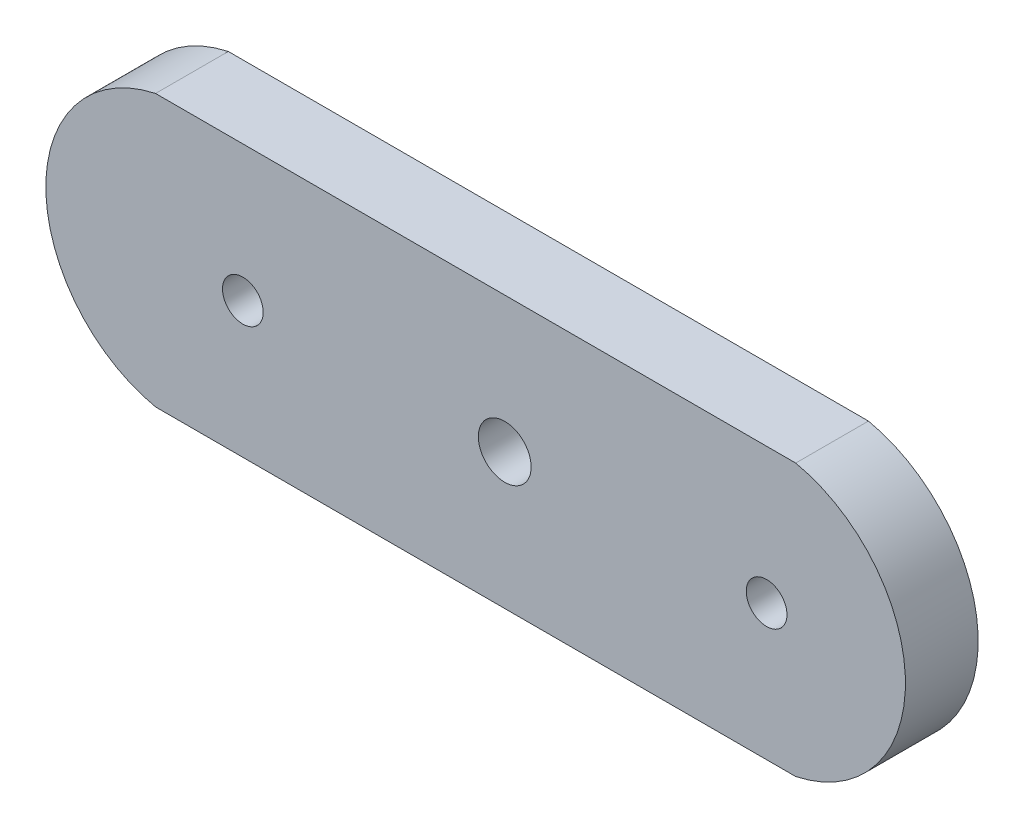
ISO-10303-21;
HEADER;
FILE_DESCRIPTION(('STEP AP214'),'2;1');
FILE_NAME('part.step','',(''),(''),'','','');
FILE_SCHEMA(('AUTOMOTIVE_DESIGN { 1 0 10303 214 1 1 1 1 }'));
ENDSEC;
DATA;
#1=APPLICATION_CONTEXT('core data for automotive mechanical design processes');
#2=APPLICATION_PROTOCOL_DEFINITION('international standard','automotive_design',2000,#1);
#3=PRODUCT_CONTEXT('',#1,'mechanical');
#4=PRODUCT('Part','Part','',(#3));
#5=PRODUCT_RELATED_PRODUCT_CATEGORY('part','',(#4));
#6=PRODUCT_DEFINITION_FORMATION('','',#4);
#7=PRODUCT_DEFINITION_CONTEXT('part definition',#1,'design');
#8=PRODUCT_DEFINITION('design','',#6,#7);
#9=PRODUCT_DEFINITION_SHAPE('','',#8);
#10=(LENGTH_UNIT() NAMED_UNIT(*) SI_UNIT(.MILLI.,.METRE.));
#11=(NAMED_UNIT(*) PLANE_ANGLE_UNIT() SI_UNIT($,.RADIAN.));
#12=(NAMED_UNIT(*) SI_UNIT($,.STERADIAN.) SOLID_ANGLE_UNIT());
#13=UNCERTAINTY_MEASURE_WITH_UNIT(LENGTH_MEASURE(1.E-05),#10,'distance_accuracy_value','');
#14=(GEOMETRIC_REPRESENTATION_CONTEXT(3) GLOBAL_UNCERTAINTY_ASSIGNED_CONTEXT((#13)) GLOBAL_UNIT_ASSIGNED_CONTEXT((#10,
#11,#12)) REPRESENTATION_CONTEXT('',''));
#15=CARTESIAN_POINT('',(0.,0.,0.));
#16=DIRECTION('',(0.,0.,1.));
#17=DIRECTION('',(1.,0.,0.));
#18=AXIS2_PLACEMENT_3D('',#15,#16,#17);
#19=CARTESIAN_POINT('',(16.51,11.8492613140312,6.35));
#20=DIRECTION('',(0.,0.,-1.));
#21=DIRECTION('',(-1.,0.,0.));
#22=AXIS2_PLACEMENT_3D('',#19,#20,#21);
#23=PLANE('',#22);
#24=CARTESIAN_POINT('',(67.31,11.8492613140312,6.35));
#25=DIRECTION('',(0.,0.,1.));
#26=DIRECTION('',(1.,0.,0.));
#27=AXIS2_PLACEMENT_3D('',#24,#25,#26);
#28=CIRCLE('',#27,1.77800000000001);
#29=CARTESIAN_POINT('',(69.088,11.8492613140312,6.35));
#30=VERTEX_POINT('',#29);
#31=EDGE_CURVE('E126',#30,#30,#28,.T.);
#32=ORIENTED_EDGE('',*,*,#31,.F.);
#33=EDGE_LOOP('',(#32));
#34=FACE_BOUND('',#33,.T.);
#35=DIRECTION('',(1.,0.,0.));
#36=VECTOR('',#35,1.);
#37=CARTESIAN_POINT('',(19.05,0.,6.35));
#38=LINE('',#37,#36);
#39=CARTESIAN_POINT('',(13.97,0.,6.35));
#40=VERTEX_POINT('',#39);
#41=CARTESIAN_POINT('',(69.85,0.,6.35));
#42=VERTEX_POINT('',#41);
#43=EDGE_CURVE('E77',#40,#42,#38,.T.);
#44=ORIENTED_EDGE('',*,*,#43,.T.);
#45=CARTESIAN_POINT('',(67.31,11.8492613140312,6.35));
#46=DIRECTION('',(0.,0.,1.));
#47=DIRECTION('',(1.,0.,0.));
#48=AXIS2_PLACEMENT_3D('',#45,#46,#47);
#49=CIRCLE('',#48,12.1184402333054);
#50=CARTESIAN_POINT('',(69.85,23.6985226280624,6.35));
#51=VERTEX_POINT('',#50);
#52=EDGE_CURVE('E80',#42,#51,#49,.T.);
#53=ORIENTED_EDGE('',*,*,#52,.T.);
#54=DIRECTION('',(-1.,0.,0.));
#55=VECTOR('',#54,1.);
#56=CARTESIAN_POINT('',(69.85,23.6985226280624,6.35));
#57=LINE('',#56,#55);
#58=CARTESIAN_POINT('',(13.97,23.6985226280624,6.35));
#59=VERTEX_POINT('',#58);
#60=EDGE_CURVE('E84',#51,#59,#57,.T.);
#61=ORIENTED_EDGE('',*,*,#60,.T.);
#62=CARTESIAN_POINT('',(16.51,11.8492613140312,6.35));
#63=DIRECTION('',(0.,0.,1.));
#64=DIRECTION('',(-1.,0.,0.));
#65=AXIS2_PLACEMENT_3D('',#62,#63,#64);
#66=CIRCLE('',#65,12.1184402333055);
#67=EDGE_CURVE('E49',#59,#40,#66,.T.);
#68=ORIENTED_EDGE('',*,*,#67,.T.);
#69=EDGE_LOOP('',(#44,#53,#61,#68));
#70=FACE_BOUND('',#69,.T.);
#71=CARTESIAN_POINT('',(44.45,11.8492613140312,6.35));
#72=DIRECTION('',(0.,0.,1.));
#73=DIRECTION('',(1.,0.,0.));
#74=AXIS2_PLACEMENT_3D('',#71,#72,#73);
#75=CIRCLE('',#74,2.305);
#76=CARTESIAN_POINT('',(46.755,11.8492613140312,6.35));
#77=VERTEX_POINT('',#76);
#78=EDGE_CURVE('E98',#77,#77,#75,.T.);
#79=ORIENTED_EDGE('',*,*,#78,.F.);
#80=EDGE_LOOP('',(#79));
#81=FACE_BOUND('',#80,.T.);
#82=CARTESIAN_POINT('',(21.59,11.8492613140312,6.35));
#83=DIRECTION('',(0.,0.,1.));
#84=DIRECTION('',(1.,0.,0.));
#85=AXIS2_PLACEMENT_3D('',#82,#83,#84);
#86=CIRCLE('',#85,1.778);
#87=CARTESIAN_POINT('',(23.368,11.8492613140312,6.35));
#88=VERTEX_POINT('',#87);
#89=EDGE_CURVE('E120',#88,#88,#86,.T.);
#90=ORIENTED_EDGE('',*,*,#89,.F.);
#91=EDGE_LOOP('',(#90));
#92=FACE_BOUND('',#91,.T.);
#93=ADVANCED_FACE('F32',(#34,#70,#81,#92),#23,.F.);
#94=CARTESIAN_POINT('',(16.51,11.8492613140312,0.));
#95=DIRECTION('',(0.,0.,-1.));
#96=DIRECTION('',(-1.,0.,0.));
#97=AXIS2_PLACEMENT_3D('',#94,#95,#96);
#98=PLANE('',#97);
#99=CARTESIAN_POINT('',(67.31,11.8492613140312,0.));
#100=DIRECTION('',(0.,0.,1.));
#101=DIRECTION('',(1.,0.,0.));
#102=AXIS2_PLACEMENT_3D('',#99,#100,#101);
#103=CIRCLE('',#102,1.77800000000001);
#104=CARTESIAN_POINT('',(69.088,11.8492613140312,0.));
#105=VERTEX_POINT('',#104);
#106=EDGE_CURVE('E123',#105,#105,#103,.T.);
#107=ORIENTED_EDGE('',*,*,#106,.T.);
#108=EDGE_LOOP('',(#107));
#109=FACE_BOUND('',#108,.T.);
#110=DIRECTION('',(1.,0.,0.));
#111=VECTOR('',#110,1.);
#112=CARTESIAN_POINT('',(19.05,0.,0.));
#113=LINE('',#112,#111);
#114=CARTESIAN_POINT('',(13.97,0.,0.));
#115=VERTEX_POINT('',#114);
#116=CARTESIAN_POINT('',(69.85,0.,0.));
#117=VERTEX_POINT('',#116);
#118=EDGE_CURVE('E72',#115,#117,#113,.T.);
#119=ORIENTED_EDGE('',*,*,#118,.F.);
#120=CARTESIAN_POINT('',(16.51,11.8492613140312,0.));
#121=DIRECTION('',(0.,0.,1.));
#122=DIRECTION('',(-1.,0.,0.));
#123=AXIS2_PLACEMENT_3D('',#120,#121,#122);
#124=CIRCLE('',#123,12.1184402333055);
#125=CARTESIAN_POINT('',(13.97,23.6985226280624,0.));
#126=VERTEX_POINT('',#125);
#127=EDGE_CURVE('E101',#126,#115,#124,.T.);
#128=ORIENTED_EDGE('',*,*,#127,.F.);
#129=DIRECTION('',(-1.,0.,0.));
#130=VECTOR('',#129,1.);
#131=CARTESIAN_POINT('',(19.05,23.6985226280624,0.));
#132=LINE('',#131,#130);
#133=CARTESIAN_POINT('',(69.85,23.6985226280624,0.));
#134=VERTEX_POINT('',#133);
#135=EDGE_CURVE('E65',#134,#126,#132,.T.);
#136=ORIENTED_EDGE('',*,*,#135,.F.);
#137=CARTESIAN_POINT('',(67.31,11.8492613140312,0.));
#138=DIRECTION('',(0.,0.,1.));
#139=DIRECTION('',(1.,0.,0.));
#140=AXIS2_PLACEMENT_3D('',#137,#138,#139);
#141=CIRCLE('',#140,12.1184402333054);
#142=EDGE_CURVE('E89',#117,#134,#141,.T.);
#143=ORIENTED_EDGE('',*,*,#142,.F.);
#144=EDGE_LOOP('',(#119,#128,#136,#143));
#145=FACE_BOUND('',#144,.T.);
#146=CARTESIAN_POINT('',(44.45,11.8492613140312,0.));
#147=DIRECTION('',(0.,0.,1.));
#148=DIRECTION('',(1.,0.,0.));
#149=AXIS2_PLACEMENT_3D('',#146,#147,#148);
#150=CIRCLE('',#149,2.305);
#151=CARTESIAN_POINT('',(46.755,11.8492613140312,0.));
#152=VERTEX_POINT('',#151);
#153=EDGE_CURVE('E115',#152,#152,#150,.T.);
#154=ORIENTED_EDGE('',*,*,#153,.T.);
#155=EDGE_LOOP('',(#154));
#156=FACE_BOUND('',#155,.T.);
#157=CARTESIAN_POINT('',(21.59,11.8492613140312,0.));
#158=DIRECTION('',(0.,0.,1.));
#159=DIRECTION('',(1.,0.,0.));
#160=AXIS2_PLACEMENT_3D('',#157,#158,#159);
#161=CIRCLE('',#160,1.778);
#162=CARTESIAN_POINT('',(23.368,11.8492613140312,0.));
#163=VERTEX_POINT('',#162);
#164=EDGE_CURVE('E118',#163,#163,#161,.T.);
#165=ORIENTED_EDGE('',*,*,#164,.T.);
#166=EDGE_LOOP('',(#165));
#167=FACE_BOUND('',#166,.T.);
#168=ADVANCED_FACE('F107',(#109,#145,#156,#167),#98,.T.);
#169=CARTESIAN_POINT('',(19.05,0.,6.35));
#170=DIRECTION('',(0.,1.,0.));
#171=DIRECTION('',(-1.,0.,0.));
#172=AXIS2_PLACEMENT_3D('',#169,#170,#171);
#173=PLANE('',#172);
#174=ORIENTED_EDGE('',*,*,#118,.T.);
#175=DIRECTION('',(0.,0.,-1.));
#176=VECTOR('',#175,1.);
#177=CARTESIAN_POINT('',(69.85,0.,6.35));
#178=LINE('',#177,#176);
#179=EDGE_CURVE('E11',#42,#117,#178,.T.);
#180=ORIENTED_EDGE('',*,*,#179,.F.);
#181=ORIENTED_EDGE('',*,*,#43,.F.);
#182=DIRECTION('',(0.,0.,-1.));
#183=VECTOR('',#182,1.);
#184=CARTESIAN_POINT('',(13.97,0.,6.35));
#185=LINE('',#184,#183);
#186=EDGE_CURVE('E93',#40,#115,#185,.T.);
#187=ORIENTED_EDGE('',*,*,#186,.T.);
#188=EDGE_LOOP('',(#174,#180,#181,#187));
#189=FACE_BOUND('',#188,.T.);
#190=ADVANCED_FACE('F34',(#189),#173,.F.);
#191=CARTESIAN_POINT('',(67.31,11.8492613140312,6.35));
#192=DIRECTION('',(0.,0.,-1.));
#193=DIRECTION('',(-1.,0.,0.));
#194=AXIS2_PLACEMENT_3D('',#191,#192,#193);
#195=CYLINDRICAL_SURFACE('',#194,12.1184402333054);
#196=ORIENTED_EDGE('',*,*,#142,.T.);
#197=DIRECTION('',(0.,0.,-1.));
#198=VECTOR('',#197,1.);
#199=CARTESIAN_POINT('',(69.85,23.6985226280624,6.35));
#200=LINE('',#199,#198);
#201=EDGE_CURVE('E41',#51,#134,#200,.T.);
#202=ORIENTED_EDGE('',*,*,#201,.F.);
#203=ORIENTED_EDGE('',*,*,#52,.F.);
#204=ORIENTED_EDGE('',*,*,#179,.T.);
#205=EDGE_LOOP('',(#196,#202,#203,#204));
#206=FACE_BOUND('',#205,.T.);
#207=ADVANCED_FACE('F88',(#206),#195,.T.);
#208=CARTESIAN_POINT('',(19.05,23.6985226280624,6.35));
#209=DIRECTION('',(0.,-1.,0.));
#210=DIRECTION('',(1.,0.,0.));
#211=AXIS2_PLACEMENT_3D('',#208,#209,#210);
#212=PLANE('',#211);
#213=ORIENTED_EDGE('',*,*,#135,.T.);
#214=DIRECTION('',(0.,0.,-1.));
#215=VECTOR('',#214,1.);
#216=CARTESIAN_POINT('',(13.97,23.6985226280624,6.35));
#217=LINE('',#216,#215);
#218=EDGE_CURVE('E90',#59,#126,#217,.T.);
#219=ORIENTED_EDGE('',*,*,#218,.F.);
#220=ORIENTED_EDGE('',*,*,#60,.F.);
#221=ORIENTED_EDGE('',*,*,#201,.T.);
#222=EDGE_LOOP('',(#213,#219,#220,#221));
#223=FACE_BOUND('',#222,.T.);
#224=ADVANCED_FACE('F91',(#223),#212,.F.);
#225=CARTESIAN_POINT('',(16.51,11.8492613140312,6.35));
#226=DIRECTION('',(0.,0.,-1.));
#227=DIRECTION('',(-1.,0.,0.));
#228=AXIS2_PLACEMENT_3D('',#225,#226,#227);
#229=CYLINDRICAL_SURFACE('',#228,12.1184402333055);
#230=ORIENTED_EDGE('',*,*,#127,.T.);
#231=ORIENTED_EDGE('',*,*,#186,.F.);
#232=ORIENTED_EDGE('',*,*,#67,.F.);
#233=ORIENTED_EDGE('',*,*,#218,.T.);
#234=EDGE_LOOP('',(#230,#231,#232,#233));
#235=FACE_BOUND('',#234,.T.);
#236=ADVANCED_FACE('F106',(#235),#229,.T.);
#237=CARTESIAN_POINT('',(44.45,11.8492613140312,6.35));
#238=DIRECTION('',(0.,0.,-1.));
#239=DIRECTION('',(-1.,0.,0.));
#240=AXIS2_PLACEMENT_3D('',#237,#238,#239);
#241=CYLINDRICAL_SURFACE('',#240,2.305);
#242=ORIENTED_EDGE('',*,*,#78,.T.);
#243=EDGE_LOOP('',(#242));
#244=FACE_BOUND('',#243,.T.);
#245=ORIENTED_EDGE('',*,*,#153,.F.);
#246=EDGE_LOOP('',(#245));
#247=FACE_BOUND('',#246,.T.);
#248=ADVANCED_FACE('F135',(#244,#247),#241,.F.);
#249=CARTESIAN_POINT('',(67.31,11.8492613140312,6.35));
#250=DIRECTION('',(0.,0.,-1.));
#251=DIRECTION('',(-1.,0.,0.));
#252=AXIS2_PLACEMENT_3D('',#249,#250,#251);
#253=CYLINDRICAL_SURFACE('',#252,1.77800000000001);
#254=ORIENTED_EDGE('',*,*,#31,.T.);
#255=EDGE_LOOP('',(#254));
#256=FACE_BOUND('',#255,.T.);
#257=ORIENTED_EDGE('',*,*,#106,.F.);
#258=EDGE_LOOP('',(#257));
#259=FACE_BOUND('',#258,.T.);
#260=ADVANCED_FACE('F145',(#256,#259),#253,.F.);
#261=CARTESIAN_POINT('',(21.59,11.8492613140312,6.35));
#262=DIRECTION('',(0.,0.,-1.));
#263=DIRECTION('',(-1.,0.,0.));
#264=AXIS2_PLACEMENT_3D('',#261,#262,#263);
#265=CYLINDRICAL_SURFACE('',#264,1.778);
#266=ORIENTED_EDGE('',*,*,#89,.T.);
#267=EDGE_LOOP('',(#266));
#268=FACE_BOUND('',#267,.T.);
#269=ORIENTED_EDGE('',*,*,#164,.F.);
#270=EDGE_LOOP('',(#269));
#271=FACE_BOUND('',#270,.T.);
#272=ADVANCED_FACE('F143',(#268,#271),#265,.F.);
#273=CLOSED_SHELL('',(#93,#168,#190,#207,#224,#236,#248,#260,#272));
#274=MANIFOLD_SOLID_BREP('B2',#273);
#275=ADVANCED_BREP_SHAPE_REPRESENTATION('',(#18,#274),#14);
#276=SHAPE_DEFINITION_REPRESENTATION(#9,#275);
ENDSEC;
END-ISO-10303-21;
